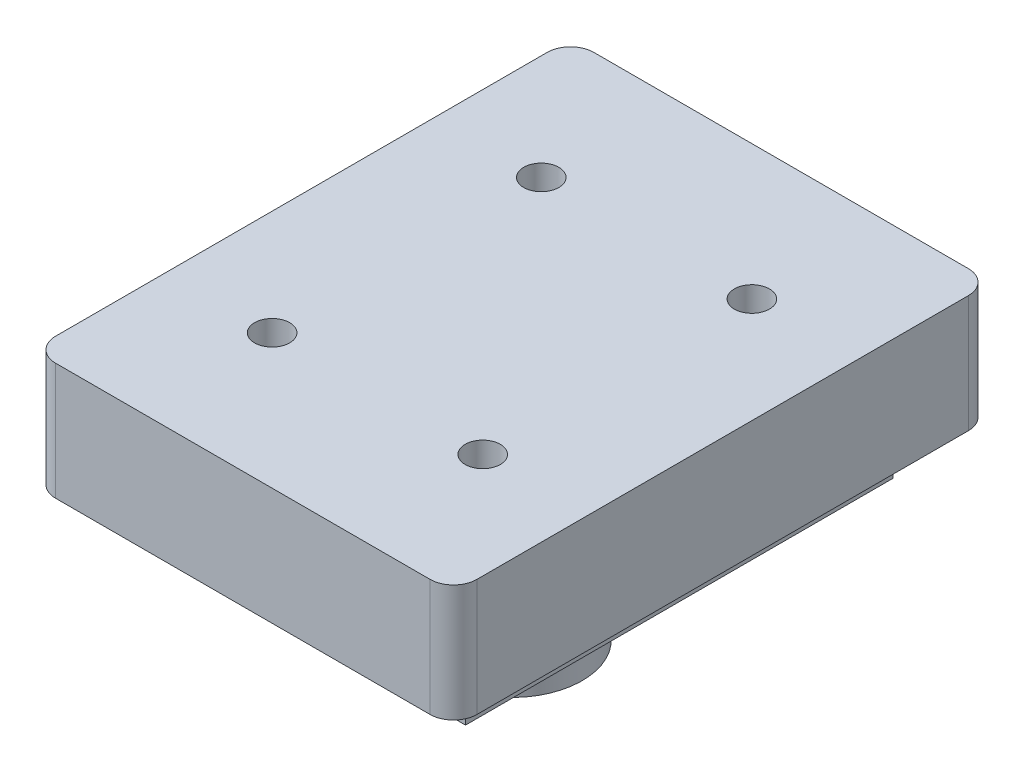
ISO-10303-21;
HEADER;
FILE_DESCRIPTION(('STEP AP214'),'2;1');
FILE_NAME('part.step','',(''),(''),'','','');
FILE_SCHEMA(('AUTOMOTIVE_DESIGN { 1 0 10303 214 1 1 1 1 }'));
ENDSEC;
DATA;
#1=APPLICATION_CONTEXT('core data for automotive mechanical design processes');
#2=APPLICATION_PROTOCOL_DEFINITION('international standard','automotive_design',2000,#1);
#3=PRODUCT_CONTEXT('',#1,'mechanical');
#4=PRODUCT('Part','Part','',(#3));
#5=PRODUCT_RELATED_PRODUCT_CATEGORY('part','',(#4));
#6=PRODUCT_DEFINITION_FORMATION('','',#4);
#7=PRODUCT_DEFINITION_CONTEXT('part definition',#1,'design');
#8=PRODUCT_DEFINITION('design','',#6,#7);
#9=PRODUCT_DEFINITION_SHAPE('','',#8);
#10=(LENGTH_UNIT() NAMED_UNIT(*) SI_UNIT(.MILLI.,.METRE.));
#11=(NAMED_UNIT(*) PLANE_ANGLE_UNIT() SI_UNIT($,.RADIAN.));
#12=(NAMED_UNIT(*) SI_UNIT($,.STERADIAN.) SOLID_ANGLE_UNIT());
#13=UNCERTAINTY_MEASURE_WITH_UNIT(LENGTH_MEASURE(1.E-05),#10,'distance_accuracy_value','');
#14=(GEOMETRIC_REPRESENTATION_CONTEXT(3) GLOBAL_UNCERTAINTY_ASSIGNED_CONTEXT((#13)) GLOBAL_UNIT_ASSIGNED_CONTEXT((#10,
#11,#12)) REPRESENTATION_CONTEXT('',''));
#15=CARTESIAN_POINT('',(0.,0.,0.));
#16=DIRECTION('',(0.,0.,1.));
#17=DIRECTION('',(1.,0.,0.));
#18=AXIS2_PLACEMENT_3D('',#15,#16,#17);
#19=CARTESIAN_POINT('',(0.,0.,0.));
#20=DIRECTION('',(0.,1.00000000000001,0.));
#21=DIRECTION('',(0.,0.,1.00000000000001));
#22=AXIS2_PLACEMENT_3D('',#19,#20,#21);
#23=PLANE('',#22);
#24=DIRECTION('',(-0.999999999999996,0.,0.));
#25=VECTOR('',#24,1.);
#26=CARTESIAN_POINT('',(-19.985789473684,0.,-28.650956937799));
#27=LINE('',#26,#25);
#28=CARTESIAN_POINT('',(23.1942105263158,0.,-28.650956937799));
#29=VERTEX_POINT('',#28);
#30=CARTESIAN_POINT('',(-17.445789473684,0.,-28.6509569377991));
#31=VERTEX_POINT('',#30);
#32=EDGE_CURVE('E208',#29,#31,#27,.T.);
#33=ORIENTED_EDGE('',*,*,#32,.F.);
#34=CARTESIAN_POINT('',(23.1942105263158,0.,-26.110956937799));
#35=DIRECTION('',(0.,1.00000000000001,0.));
#36=DIRECTION('',(0.,0.,1.00000000000001));
#37=AXIS2_PLACEMENT_3D('',#34,#35,#36);
#38=CIRCLE('',#37,2.54);
#39=CARTESIAN_POINT('',(25.7342105263158,0.,-26.110956937799));
#40=VERTEX_POINT('',#39);
#41=EDGE_CURVE('E252',#29,#40,#38,.F.);
#42=ORIENTED_EDGE('',*,*,#41,.T.);
#43=DIRECTION('',(0.,0.,-1.00000000000001));
#44=VECTOR('',#43,1.);
#45=CARTESIAN_POINT('',(25.7342105263158,0.,-28.650956937799));
#46=LINE('',#45,#44);
#47=CARTESIAN_POINT('',(25.7342105263158,0.,27.2290430622013));
#48=VERTEX_POINT('',#47);
#49=EDGE_CURVE('E226',#48,#40,#46,.T.);
#50=ORIENTED_EDGE('',*,*,#49,.F.);
#51=CARTESIAN_POINT('',(23.1942105263158,-1.11022302462516E-13,27.2290430622014));
#52=DIRECTION('',(0.,1.00000000000001,0.));
#53=DIRECTION('',(0.,0.,1.00000000000001));
#54=AXIS2_PLACEMENT_3D('',#51,#52,#53);
#55=CIRCLE('',#54,2.54);
#56=CARTESIAN_POINT('',(23.1942105263158,-1.11022302462516E-13,29.7690430622013));
#57=VERTEX_POINT('',#56);
#58=EDGE_CURVE('E243',#48,#57,#55,.F.);
#59=ORIENTED_EDGE('',*,*,#58,.T.);
#60=DIRECTION('',(0.999999999999996,0.,0.));
#61=VECTOR('',#60,1.);
#62=CARTESIAN_POINT('',(-19.9857894736841,1.38777878078145E-13,29.7690430622012));
#63=LINE('',#62,#61);
#64=CARTESIAN_POINT('',(-17.4457894736841,0.,29.7690430622012));
#65=VERTEX_POINT('',#64);
#66=EDGE_CURVE('E223',#65,#57,#63,.T.);
#67=ORIENTED_EDGE('',*,*,#66,.F.);
#68=CARTESIAN_POINT('',(-17.4457894736841,1.11022302462516E-13,27.2290430622013));
#69=DIRECTION('',(0.,1.00000000000001,0.));
#70=DIRECTION('',(0.,0.,1.00000000000001));
#71=AXIS2_PLACEMENT_3D('',#68,#69,#70);
#72=CIRCLE('',#71,2.54);
#73=CARTESIAN_POINT('',(-19.9857894736841,0.,27.2290430622011));
#74=VERTEX_POINT('',#73);
#75=EDGE_CURVE('E246',#65,#74,#72,.F.);
#76=ORIENTED_EDGE('',*,*,#75,.T.);
#77=DIRECTION('',(0.,0.,1.00000000000001));
#78=VECTOR('',#77,1.);
#79=CARTESIAN_POINT('',(-19.985789473684,0.,-28.650956937799));
#80=LINE('',#79,#78);
#81=CARTESIAN_POINT('',(-19.985789473684,0.,-26.110956937799));
#82=VERTEX_POINT('',#81);
#83=EDGE_CURVE('E200',#82,#74,#80,.T.);
#84=ORIENTED_EDGE('',*,*,#83,.F.);
#85=CARTESIAN_POINT('',(-17.445789473684,0.,-26.110956937799));
#86=DIRECTION('',(0.,1.00000000000001,0.));
#87=DIRECTION('',(0.,0.,1.00000000000001));
#88=AXIS2_PLACEMENT_3D('',#85,#86,#87);
#89=CIRCLE('',#88,2.54);
#90=EDGE_CURVE('E249',#82,#31,#89,.F.);
#91=ORIENTED_EDGE('',*,*,#90,.T.);
#92=EDGE_LOOP('',(#33,#42,#50,#59,#67,#76,#84,#91));
#93=FACE_BOUND('',#92,.T.);
#94=DIRECTION('',(0.,0.,-1.));
#95=VECTOR('',#94,1.);
#96=CARTESIAN_POINT('',(-15.2895205198493,0.,23.7682549545235));
#97=LINE('',#96,#95);
#98=CARTESIAN_POINT('',(-15.2895205198493,0.,23.7682549545235));
#99=VERTEX_POINT('',#98);
#100=CARTESIAN_POINT('',(-15.2895205198492,0.,-22.6501688301212));
#101=VERTEX_POINT('',#100);
#102=EDGE_CURVE('E162',#99,#101,#97,.T.);
#103=ORIENTED_EDGE('',*,*,#102,.F.);
#104=DIRECTION('',(-0.999999999999996,0.,0.));
#105=VECTOR('',#104,1.);
#106=CARTESIAN_POINT('',(-15.2895205198493,0.,23.7682549545235));
#107=LINE('',#106,#105);
#108=CARTESIAN_POINT('',(21.037941572481,0.,23.7682549545235));
#109=VERTEX_POINT('',#108);
#110=EDGE_CURVE('E159',#109,#99,#107,.T.);
#111=ORIENTED_EDGE('',*,*,#110,.F.);
#112=DIRECTION('',(0.,0.,1.));
#113=VECTOR('',#112,1.);
#114=CARTESIAN_POINT('',(21.037941572481,0.,23.7682549545235));
#115=LINE('',#114,#113);
#116=CARTESIAN_POINT('',(21.037941572481,0.,-22.6501688301212));
#117=VERTEX_POINT('',#116);
#118=EDGE_CURVE('E615',#117,#109,#115,.T.);
#119=ORIENTED_EDGE('',*,*,#118,.F.);
#120=DIRECTION('',(0.999999999999996,0.,0.));
#121=VECTOR('',#120,1.);
#122=CARTESIAN_POINT('',(-15.2895205198492,0.,-22.6501688301212));
#123=LINE('',#122,#121);
#124=EDGE_CURVE('E612',#101,#117,#123,.T.);
#125=ORIENTED_EDGE('',*,*,#124,.F.);
#126=EDGE_LOOP('',(#103,#111,#119,#125));
#127=FACE_BOUND('',#126,.T.);
#128=ADVANCED_FACE('F45',(#93,#127),#23,.F.);
#129=CARTESIAN_POINT('',(-19.985789473684,12.7000000000003,-28.650956937799));
#130=DIRECTION('',(0.999999999999996,0.,0.));
#131=DIRECTION('',(0.,0.,-1.00000000000001));
#132=AXIS2_PLACEMENT_3D('',#129,#130,#131);
#133=PLANE('',#132);
#134=DIRECTION('',(0.,0.,1.00000000000001));
#135=VECTOR('',#134,1.);
#136=CARTESIAN_POINT('',(-19.985789473684,12.7000000000003,-28.650956937799));
#137=LINE('',#136,#135);
#138=CARTESIAN_POINT('',(-19.985789473684,12.7000000000003,-26.110956937799));
#139=VERTEX_POINT('',#138);
#140=CARTESIAN_POINT('',(-19.9857894736841,12.7000000000003,27.2290430622012));
#141=VERTEX_POINT('',#140);
#142=EDGE_CURVE('E204',#139,#141,#137,.T.);
#143=ORIENTED_EDGE('',*,*,#142,.F.);
#144=DIRECTION('',(0.,-1.00000000000001,0.));
#145=VECTOR('',#144,1.);
#146=CARTESIAN_POINT('',(-19.985789473684,12.7000000000003,-26.110956937799));
#147=LINE('',#146,#145);
#148=EDGE_CURVE('E276',#139,#82,#147,.T.);
#149=ORIENTED_EDGE('',*,*,#148,.T.);
#150=ORIENTED_EDGE('',*,*,#83,.T.);
#151=DIRECTION('',(0.,-1.00000000000001,0.));
#152=VECTOR('',#151,1.);
#153=CARTESIAN_POINT('',(-19.9857894736841,12.7000000000003,27.2290430622012));
#154=LINE('',#153,#152);
#155=EDGE_CURVE('E273',#74,#141,#154,.F.);
#156=ORIENTED_EDGE('',*,*,#155,.T.);
#157=EDGE_LOOP('',(#143,#149,#150,#156));
#158=FACE_BOUND('',#157,.T.);
#159=ADVANCED_FACE('F317',(#158),#133,.F.);
#160=CARTESIAN_POINT('',(-19.9857894736841,12.7000000000002,29.7690430622013));
#161=DIRECTION('',(0.,0.,-1.00000000000001));
#162=DIRECTION('',(-0.999999999999996,0.,0.));
#163=AXIS2_PLACEMENT_3D('',#160,#161,#162);
#164=PLANE('',#163);
#165=DIRECTION('',(0.999999999999996,0.,0.));
#166=VECTOR('',#165,1.);
#167=CARTESIAN_POINT('',(-19.9857894736841,12.7000000000002,29.7690430622013));
#168=LINE('',#167,#166);
#169=CARTESIAN_POINT('',(-17.4457894736841,12.7000000000001,29.7690430622013));
#170=VERTEX_POINT('',#169);
#171=CARTESIAN_POINT('',(23.1942105263157,12.7000000000001,29.7690430622014));
#172=VERTEX_POINT('',#171);
#173=EDGE_CURVE('E207',#170,#172,#168,.T.);
#174=ORIENTED_EDGE('',*,*,#173,.F.);
#175=DIRECTION('',(0.,-1.00000000000001,0.));
#176=VECTOR('',#175,1.);
#177=CARTESIAN_POINT('',(-17.4457894736841,12.7000000000001,29.7690430622013));
#178=LINE('',#177,#176);
#179=EDGE_CURVE('E11',#170,#65,#178,.T.);
#180=ORIENTED_EDGE('',*,*,#179,.T.);
#181=ORIENTED_EDGE('',*,*,#66,.T.);
#182=DIRECTION('',(0.,-1.00000000000001,0.));
#183=VECTOR('',#182,1.);
#184=CARTESIAN_POINT('',(23.1942105263157,12.7000000000001,29.7690430622014));
#185=LINE('',#184,#183);
#186=EDGE_CURVE('E54',#57,#172,#185,.F.);
#187=ORIENTED_EDGE('',*,*,#186,.T.);
#188=EDGE_LOOP('',(#174,#180,#181,#187));
#189=FACE_BOUND('',#188,.T.);
#190=ADVANCED_FACE('F328',(#189),#164,.F.);
#191=CARTESIAN_POINT('',(25.7342105263158,12.7,-28.650956937799));
#192=DIRECTION('',(-0.999999999999996,0.,0.));
#193=DIRECTION('',(0.,0.,1.00000000000001));
#194=AXIS2_PLACEMENT_3D('',#191,#192,#193);
#195=PLANE('',#194);
#196=ORIENTED_EDGE('',*,*,#49,.T.);
#197=DIRECTION('',(0.,-1.00000000000001,0.));
#198=VECTOR('',#197,1.);
#199=CARTESIAN_POINT('',(25.7342105263158,12.7,-26.110956937799));
#200=LINE('',#199,#198);
#201=CARTESIAN_POINT('',(25.7342105263158,12.7,-26.110956937799));
#202=VERTEX_POINT('',#201);
#203=EDGE_CURVE('E259',#40,#202,#200,.F.);
#204=ORIENTED_EDGE('',*,*,#203,.T.);
#205=DIRECTION('',(0.,0.,-1.00000000000001));
#206=VECTOR('',#205,1.);
#207=CARTESIAN_POINT('',(25.7342105263158,12.7,-28.650956937799));
#208=LINE('',#207,#206);
#209=CARTESIAN_POINT('',(25.7342105263158,12.7,27.2290430622013));
#210=VERTEX_POINT('',#209);
#211=EDGE_CURVE('E211',#210,#202,#208,.T.);
#212=ORIENTED_EDGE('',*,*,#211,.F.);
#213=DIRECTION('',(0.,-1.00000000000001,0.));
#214=VECTOR('',#213,1.);
#215=CARTESIAN_POINT('',(25.7342105263158,12.7,27.2290430622013));
#216=LINE('',#215,#214);
#217=EDGE_CURVE('E255',#210,#48,#216,.T.);
#218=ORIENTED_EDGE('',*,*,#217,.T.);
#219=EDGE_LOOP('',(#196,#204,#212,#218));
#220=FACE_BOUND('',#219,.T.);
#221=ADVANCED_FACE('F336',(#220),#195,.F.);
#222=CARTESIAN_POINT('',(-19.985789473684,12.7000000000003,-28.650956937799));
#223=DIRECTION('',(0.,0.,1.00000000000001));
#224=DIRECTION('',(0.999999999999996,0.,0.));
#225=AXIS2_PLACEMENT_3D('',#222,#223,#224);
#226=PLANE('',#225);
#227=DIRECTION('',(-0.999999999999996,0.,0.));
#228=VECTOR('',#227,1.);
#229=CARTESIAN_POINT('',(-19.985789473684,12.7000000000003,-28.650956937799));
#230=LINE('',#229,#228);
#231=CARTESIAN_POINT('',(23.1942105263158,12.7,-28.650956937799));
#232=VERTEX_POINT('',#231);
#233=CARTESIAN_POINT('',(-17.445789473684,12.7000000000003,-28.6509569377989));
#234=VERTEX_POINT('',#233);
#235=EDGE_CURVE('E215',#232,#234,#230,.T.);
#236=ORIENTED_EDGE('',*,*,#235,.F.);
#237=DIRECTION('',(0.,-1.00000000000001,0.));
#238=VECTOR('',#237,1.);
#239=CARTESIAN_POINT('',(23.1942105263158,12.7,-28.650956937799));
#240=LINE('',#239,#238);
#241=EDGE_CURVE('E239',#232,#29,#240,.T.);
#242=ORIENTED_EDGE('',*,*,#241,.T.);
#243=ORIENTED_EDGE('',*,*,#32,.T.);
#244=DIRECTION('',(0.,-1.00000000000001,0.));
#245=VECTOR('',#244,1.);
#246=CARTESIAN_POINT('',(-17.445789473684,12.7000000000003,-28.6509569377989));
#247=LINE('',#246,#245);
#248=EDGE_CURVE('E236',#31,#234,#247,.F.);
#249=ORIENTED_EDGE('',*,*,#248,.T.);
#250=EDGE_LOOP('',(#236,#242,#243,#249));
#251=FACE_BOUND('',#250,.T.);
#252=ADVANCED_FACE('F344',(#251),#226,.F.);
#253=CARTESIAN_POINT('',(0.,12.7000000000002,2.0122792321331E-13));
#254=DIRECTION('',(0.,1.00000000000001,0.));
#255=DIRECTION('',(0.,0.,1.00000000000001));
#256=AXIS2_PLACEMENT_3D('',#253,#254,#255);
#257=PLANE('',#256);
#258=CARTESIAN_POINT('',(14.3042105263158,12.7,-14.045956937799));
#259=DIRECTION('',(0.,1.00000000000001,0.));
#260=DIRECTION('',(0.,0.,1.00000000000001));
#261=AXIS2_PLACEMENT_3D('',#258,#259,#260);
#262=CIRCLE('',#261,1.905);
#263=CARTESIAN_POINT('',(14.3042105263158,12.7,-12.140956937799));
#264=VERTEX_POINT('',#263);
#265=EDGE_CURVE('E185',#264,#264,#262,.T.);
#266=ORIENTED_EDGE('',*,*,#265,.F.);
#267=EDGE_LOOP('',(#266));
#268=FACE_BOUND('',#267,.T.);
#269=CARTESIAN_POINT('',(-8.55578947368408,12.7000000000002,15.1640430622012));
#270=DIRECTION('',(0.,1.00000000000001,0.));
#271=DIRECTION('',(0.,0.,1.00000000000001));
#272=AXIS2_PLACEMENT_3D('',#269,#270,#271);
#273=CIRCLE('',#272,1.905);
#274=CARTESIAN_POINT('',(-8.55578947368408,12.7000000000002,17.0690430622012));
#275=VERTEX_POINT('',#274);
#276=EDGE_CURVE('E178',#275,#275,#273,.T.);
#277=ORIENTED_EDGE('',*,*,#276,.F.);
#278=EDGE_LOOP('',(#277));
#279=FACE_BOUND('',#278,.T.);
#280=CARTESIAN_POINT('',(14.3042105263158,12.7000000000001,15.1640430622013));
#281=DIRECTION('',(0.,1.00000000000001,0.));
#282=DIRECTION('',(0.,0.,1.00000000000001));
#283=AXIS2_PLACEMENT_3D('',#280,#281,#282);
#284=CIRCLE('',#283,1.905);
#285=CARTESIAN_POINT('',(14.3042105263158,12.7000000000001,17.0690430622013));
#286=VERTEX_POINT('',#285);
#287=EDGE_CURVE('E164',#286,#286,#284,.T.);
#288=ORIENTED_EDGE('',*,*,#287,.F.);
#289=EDGE_LOOP('',(#288));
#290=FACE_BOUND('',#289,.T.);
#291=CARTESIAN_POINT('',(-8.55578947368407,12.7000000000003,-14.0459569377989));
#292=DIRECTION('',(0.,1.00000000000001,0.));
#293=DIRECTION('',(0.,0.,1.00000000000001));
#294=AXIS2_PLACEMENT_3D('',#291,#292,#293);
#295=CIRCLE('',#294,1.905);
#296=CARTESIAN_POINT('',(-8.55578947368407,12.7000000000003,-12.1409569377989));
#297=VERTEX_POINT('',#296);
#298=EDGE_CURVE('E184',#297,#297,#295,.T.);
#299=ORIENTED_EDGE('',*,*,#298,.F.);
#300=EDGE_LOOP('',(#299));
#301=FACE_BOUND('',#300,.T.);
#302=ORIENTED_EDGE('',*,*,#211,.T.);
#303=CARTESIAN_POINT('',(23.1942105263158,12.7,-26.110956937799));
#304=DIRECTION('',(0.,1.00000000000001,0.));
#305=DIRECTION('',(0.,0.,1.00000000000001));
#306=AXIS2_PLACEMENT_3D('',#303,#304,#305);
#307=CIRCLE('',#306,2.54);
#308=EDGE_CURVE('E270',#202,#232,#307,.T.);
#309=ORIENTED_EDGE('',*,*,#308,.T.);
#310=ORIENTED_EDGE('',*,*,#235,.T.);
#311=CARTESIAN_POINT('',(-17.445789473684,12.7000000000003,-26.110956937799));
#312=DIRECTION('',(0.,1.00000000000001,0.));
#313=DIRECTION('',(0.,0.,1.00000000000001));
#314=AXIS2_PLACEMENT_3D('',#311,#312,#313);
#315=CIRCLE('',#314,2.54);
#316=EDGE_CURVE('E267',#234,#139,#315,.T.);
#317=ORIENTED_EDGE('',*,*,#316,.T.);
#318=ORIENTED_EDGE('',*,*,#142,.T.);
#319=CARTESIAN_POINT('',(-17.4457894736842,12.7000000000002,27.2290430622013));
#320=DIRECTION('',(0.,1.00000000000001,0.));
#321=DIRECTION('',(0.,0.,1.00000000000001));
#322=AXIS2_PLACEMENT_3D('',#319,#320,#321);
#323=CIRCLE('',#322,2.54);
#324=EDGE_CURVE('E67',#141,#170,#323,.T.);
#325=ORIENTED_EDGE('',*,*,#324,.T.);
#326=ORIENTED_EDGE('',*,*,#173,.T.);
#327=CARTESIAN_POINT('',(23.1942105263158,12.7000000000001,27.2290430622013));
#328=DIRECTION('',(0.,1.00000000000001,0.));
#329=DIRECTION('',(0.,0.,1.00000000000001));
#330=AXIS2_PLACEMENT_3D('',#327,#328,#329);
#331=CIRCLE('',#330,2.54);
#332=EDGE_CURVE('E262',#172,#210,#331,.T.);
#333=ORIENTED_EDGE('',*,*,#332,.T.);
#334=EDGE_LOOP('',(#302,#309,#310,#317,#318,#325,#326,#333));
#335=FACE_BOUND('',#334,.T.);
#336=ADVANCED_FACE('F330',(#268,#279,#290,#301,#335),#257,.T.);
#337=CARTESIAN_POINT('',(-8.55578947368409,0.,-14.045956937799));
#338=DIRECTION('',(0.,1.00000000000001,0.));
#339=DIRECTION('',(0.,0.,1.00000000000001));
#340=AXIS2_PLACEMENT_3D('',#337,#338,#339);
#341=CYLINDRICAL_SURFACE('',#340,1.905);
#342=CARTESIAN_POINT('',(-8.55578947368409,0.,-14.045956937799));
#343=DIRECTION('',(0.,1.00000000000001,0.));
#344=DIRECTION('',(0.,0.,1.00000000000001));
#345=AXIS2_PLACEMENT_3D('',#342,#343,#344);
#346=CIRCLE('',#345,1.905);
#347=CARTESIAN_POINT('',(-8.55578947368409,0.,-12.140956937799));
#348=VERTEX_POINT('',#347);
#349=EDGE_CURVE('E196',#348,#348,#346,.T.);
#350=ORIENTED_EDGE('',*,*,#349,.F.);
#351=EDGE_LOOP('',(#350));
#352=FACE_BOUND('',#351,.T.);
#353=ORIENTED_EDGE('',*,*,#298,.T.);
#354=EDGE_LOOP('',(#353));
#355=FACE_BOUND('',#354,.T.);
#356=ADVANCED_FACE('F387',(#352,#355),#341,.F.);
#357=CARTESIAN_POINT('',(14.3042105263158,0.,15.164043062201));
#358=DIRECTION('',(0.,1.00000000000001,0.));
#359=DIRECTION('',(0.,0.,1.00000000000001));
#360=AXIS2_PLACEMENT_3D('',#357,#358,#359);
#361=CYLINDRICAL_SURFACE('',#360,1.905);
#362=CARTESIAN_POINT('',(14.3042105263158,0.,15.164043062201));
#363=DIRECTION('',(0.,1.00000000000001,0.));
#364=DIRECTION('',(0.,0.,1.00000000000001));
#365=AXIS2_PLACEMENT_3D('',#362,#363,#364);
#366=CIRCLE('',#365,1.905);
#367=CARTESIAN_POINT('',(14.3042105263158,0.,17.069043062201));
#368=VERTEX_POINT('',#367);
#369=EDGE_CURVE('E170',#368,#368,#366,.T.);
#370=ORIENTED_EDGE('',*,*,#369,.F.);
#371=EDGE_LOOP('',(#370));
#372=FACE_BOUND('',#371,.T.);
#373=ORIENTED_EDGE('',*,*,#287,.T.);
#374=EDGE_LOOP('',(#373));
#375=FACE_BOUND('',#374,.T.);
#376=ADVANCED_FACE('F394',(#372,#375),#361,.F.);
#377=CARTESIAN_POINT('',(-8.55578947368411,0.,15.1640430622012));
#378=DIRECTION('',(0.,1.00000000000001,0.));
#379=DIRECTION('',(0.,0.,1.00000000000001));
#380=AXIS2_PLACEMENT_3D('',#377,#378,#379);
#381=CYLINDRICAL_SURFACE('',#380,1.905);
#382=CARTESIAN_POINT('',(-8.55578947368411,0.,15.1640430622012));
#383=DIRECTION('',(0.,1.00000000000001,0.));
#384=DIRECTION('',(0.,0.,1.00000000000001));
#385=AXIS2_PLACEMENT_3D('',#382,#383,#384);
#386=CIRCLE('',#385,1.905);
#387=CARTESIAN_POINT('',(-8.55578947368411,0.,17.0690430622012));
#388=VERTEX_POINT('',#387);
#389=EDGE_CURVE('E189',#388,#388,#386,.T.);
#390=ORIENTED_EDGE('',*,*,#389,.F.);
#391=EDGE_LOOP('',(#390));
#392=FACE_BOUND('',#391,.T.);
#393=ORIENTED_EDGE('',*,*,#276,.T.);
#394=EDGE_LOOP('',(#393));
#395=FACE_BOUND('',#394,.T.);
#396=ADVANCED_FACE('F401',(#392,#395),#381,.F.);
#397=CARTESIAN_POINT('',(14.3042105263158,0.,-14.045956937799));
#398=DIRECTION('',(0.,1.00000000000001,0.));
#399=DIRECTION('',(0.,0.,1.00000000000001));
#400=AXIS2_PLACEMENT_3D('',#397,#398,#399);
#401=CYLINDRICAL_SURFACE('',#400,1.905);
#402=CARTESIAN_POINT('',(14.3042105263158,0.,-14.045956937799));
#403=DIRECTION('',(0.,1.00000000000001,0.));
#404=DIRECTION('',(0.,0.,1.00000000000001));
#405=AXIS2_PLACEMENT_3D('',#402,#403,#404);
#406=CIRCLE('',#405,1.905);
#407=CARTESIAN_POINT('',(14.3042105263158,0.,-12.140956937799));
#408=VERTEX_POINT('',#407);
#409=EDGE_CURVE('E180',#408,#408,#406,.T.);
#410=ORIENTED_EDGE('',*,*,#409,.F.);
#411=EDGE_LOOP('',(#410));
#412=FACE_BOUND('',#411,.T.);
#413=ORIENTED_EDGE('',*,*,#265,.T.);
#414=EDGE_LOOP('',(#413));
#415=FACE_BOUND('',#414,.T.);
#416=ADVANCED_FACE('F409',(#412,#415),#401,.F.);
#417=CARTESIAN_POINT('',(0.,0.,0.));
#418=DIRECTION('',(0.,-1.00000000000001,0.));
#419=DIRECTION('',(0.,0.,-1.00000000000001));
#420=AXIS2_PLACEMENT_3D('',#417,#418,#419);
#421=PLANE('',#420);
#422=ORIENTED_EDGE('',*,*,#409,.T.);
#423=EDGE_LOOP('',(#422));
#424=FACE_BOUND('',#423,.T.);
#425=ADVANCED_FACE('F417',(#424),#421,.F.);
#426=ORIENTED_EDGE('',*,*,#389,.T.);
#427=EDGE_LOOP('',(#426));
#428=FACE_BOUND('',#427,.T.);
#429=ADVANCED_FACE('F425',(#428),#421,.F.);
#430=ORIENTED_EDGE('',*,*,#369,.T.);
#431=EDGE_LOOP('',(#430));
#432=FACE_BOUND('',#431,.T.);
#433=ADVANCED_FACE('F434',(#432),#421,.F.);
#434=ORIENTED_EDGE('',*,*,#349,.T.);
#435=EDGE_LOOP('',(#434));
#436=FACE_BOUND('',#435,.T.);
#437=ADVANCED_FACE('F428',(#436),#421,.F.);
#438=CARTESIAN_POINT('',(-15.2895205198493,-5.08,23.7682549545234));
#439=DIRECTION('',(0.999999999999996,0.,0.));
#440=DIRECTION('',(0.,0.,-1.));
#441=AXIS2_PLACEMENT_3D('',#438,#439,#440);
#442=PLANE('',#441);
#443=ORIENTED_EDGE('',*,*,#102,.T.);
#444=DIRECTION('',(0.,1.00000000000001,0.));
#445=VECTOR('',#444,1.);
#446=CARTESIAN_POINT('',(-15.2895205198493,-5.08,-22.6501688301212));
#447=LINE('',#446,#445);
#448=CARTESIAN_POINT('',(-15.2895205198493,-5.08,-22.6501688301212));
#449=VERTEX_POINT('',#448);
#450=EDGE_CURVE('E141',#449,#101,#447,.T.);
#451=ORIENTED_EDGE('',*,*,#450,.F.);
#452=DIRECTION('',(0.,0.,-1.));
#453=VECTOR('',#452,1.);
#454=CARTESIAN_POINT('',(-15.2895205198493,-5.08,23.7682549545234));
#455=LINE('',#454,#453);
#456=CARTESIAN_POINT('',(-15.2895205198493,-5.08,23.7682549545234));
#457=VERTEX_POINT('',#456);
#458=EDGE_CURVE('E149',#457,#449,#455,.T.);
#459=ORIENTED_EDGE('',*,*,#458,.F.);
#460=DIRECTION('',(0.,1.00000000000001,0.));
#461=VECTOR('',#460,1.);
#462=CARTESIAN_POINT('',(-15.2895205198493,-5.08,23.7682549545234));
#463=LINE('',#462,#461);
#464=EDGE_CURVE('E609',#457,#99,#463,.T.);
#465=ORIENTED_EDGE('',*,*,#464,.T.);
#466=EDGE_LOOP('',(#443,#451,#459,#465));
#467=FACE_BOUND('',#466,.T.);
#468=ADVANCED_FACE('F161',(#467),#442,.F.);
#469=CARTESIAN_POINT('',(-15.2895205198493,-5.08,-22.6501688301212));
#470=DIRECTION('',(0.,0.,1.00000000000001));
#471=DIRECTION('',(0.999999999999996,0.,0.));
#472=AXIS2_PLACEMENT_3D('',#469,#470,#471);
#473=PLANE('',#472);
#474=ORIENTED_EDGE('',*,*,#124,.T.);
#475=DIRECTION('',(0.,1.00000000000001,0.));
#476=VECTOR('',#475,1.);
#477=CARTESIAN_POINT('',(21.037941572481,-5.08,-22.6501688301212));
#478=LINE('',#477,#476);
#479=CARTESIAN_POINT('',(21.037941572481,-5.08,-22.6501688301212));
#480=VERTEX_POINT('',#479);
#481=EDGE_CURVE('E144',#480,#117,#478,.T.);
#482=ORIENTED_EDGE('',*,*,#481,.F.);
#483=DIRECTION('',(0.999999999999996,0.,0.));
#484=VECTOR('',#483,1.);
#485=CARTESIAN_POINT('',(-15.2895205198493,-5.08,-22.6501688301212));
#486=LINE('',#485,#484);
#487=EDGE_CURVE('E136',#449,#480,#486,.T.);
#488=ORIENTED_EDGE('',*,*,#487,.F.);
#489=ORIENTED_EDGE('',*,*,#450,.T.);
#490=EDGE_LOOP('',(#474,#482,#488,#489));
#491=FACE_BOUND('',#490,.T.);
#492=ADVANCED_FACE('F139',(#491),#473,.F.);
#493=CARTESIAN_POINT('',(21.037941572481,-5.08000000000004,23.7682549545232));
#494=DIRECTION('',(-0.999999999999997,0.,0.));
#495=DIRECTION('',(0.,0.,1.));
#496=AXIS2_PLACEMENT_3D('',#493,#494,#495);
#497=PLANE('',#496);
#498=ORIENTED_EDGE('',*,*,#118,.T.);
#499=DIRECTION('',(0.,1.00000000000001,0.));
#500=VECTOR('',#499,1.);
#501=CARTESIAN_POINT('',(21.037941572481,-5.08000000000004,23.7682549545232));
#502=LINE('',#501,#500);
#503=CARTESIAN_POINT('',(21.037941572481,-5.08000000000004,23.7682549545232));
#504=VERTEX_POINT('',#503);
#505=EDGE_CURVE('E172',#504,#109,#502,.T.);
#506=ORIENTED_EDGE('',*,*,#505,.F.);
#507=DIRECTION('',(0.,0.,1.));
#508=VECTOR('',#507,1.);
#509=CARTESIAN_POINT('',(21.037941572481,-5.08000000000004,23.7682549545232));
#510=LINE('',#509,#508);
#511=EDGE_CURVE('E148',#480,#504,#510,.T.);
#512=ORIENTED_EDGE('',*,*,#511,.F.);
#513=ORIENTED_EDGE('',*,*,#481,.T.);
#514=EDGE_LOOP('',(#498,#506,#512,#513));
#515=FACE_BOUND('',#514,.T.);
#516=ADVANCED_FACE('F459',(#515),#497,.F.);
#517=CARTESIAN_POINT('',(-15.2895205198493,-5.08,23.7682549545234));
#518=DIRECTION('',(0.,0.,-1.));
#519=DIRECTION('',(-0.999999999999996,0.,0.));
#520=AXIS2_PLACEMENT_3D('',#517,#518,#519);
#521=PLANE('',#520);
#522=ORIENTED_EDGE('',*,*,#110,.T.);
#523=ORIENTED_EDGE('',*,*,#464,.F.);
#524=DIRECTION('',(-0.999999999999996,0.,0.));
#525=VECTOR('',#524,1.);
#526=CARTESIAN_POINT('',(-15.2895205198493,-5.08,23.7682549545234));
#527=LINE('',#526,#525);
#528=EDGE_CURVE('E154',#504,#457,#527,.T.);
#529=ORIENTED_EDGE('',*,*,#528,.F.);
#530=ORIENTED_EDGE('',*,*,#505,.T.);
#531=EDGE_LOOP('',(#522,#523,#529,#530));
#532=FACE_BOUND('',#531,.T.);
#533=ADVANCED_FACE('F466',(#532),#521,.F.);
#534=CARTESIAN_POINT('',(0.,-5.08,1.2490009027033E-13));
#535=DIRECTION('',(0.,-1.00000000000001,0.));
#536=DIRECTION('',(0.,0.,-1.00000000000001));
#537=AXIS2_PLACEMENT_3D('',#534,#535,#536);
#538=PLANE('',#537);
#539=CARTESIAN_POINT('',(2.87421052631581,-5.08,0.559043062200962));
#540=DIRECTION('',(0.,-1.00000000000001,0.));
#541=DIRECTION('',(0.,0.,-1.00000000000001));
#542=AXIS2_PLACEMENT_3D('',#539,#540,#541);
#543=CIRCLE('',#542,7.62);
#544=CARTESIAN_POINT('',(2.87421052631581,-5.07999999999999,-7.06095693779908));
#545=VERTEX_POINT('',#544);
#546=EDGE_CURVE('E594',#545,#545,#543,.T.);
#547=ORIENTED_EDGE('',*,*,#546,.F.);
#548=EDGE_LOOP('',(#547));
#549=FACE_BOUND('',#548,.T.);
#550=ORIENTED_EDGE('',*,*,#458,.T.);
#551=ORIENTED_EDGE('',*,*,#487,.T.);
#552=ORIENTED_EDGE('',*,*,#511,.T.);
#553=ORIENTED_EDGE('',*,*,#528,.T.);
#554=EDGE_LOOP('',(#550,#551,#552,#553));
#555=FACE_BOUND('',#554,.T.);
#556=ADVANCED_FACE('F152',(#549,#555),#538,.T.);
#557=CARTESIAN_POINT('',(2.87421052631582,-17.78,0.559043062200962));
#558=DIRECTION('',(0.,-1.00000000000001,0.));
#559=DIRECTION('',(0.,0.,-1.00000000000001));
#560=AXIS2_PLACEMENT_3D('',#557,#558,#559);
#561=PLANE('',#560);
#562=CARTESIAN_POINT('',(2.87421052631582,-17.78,0.559043062200962));
#563=DIRECTION('',(0.,-1.00000000000001,0.));
#564=DIRECTION('',(0.,0.,-1.00000000000001));
#565=AXIS2_PLACEMENT_3D('',#562,#563,#564);
#566=CIRCLE('',#565,7.62);
#567=CARTESIAN_POINT('',(2.87421052631582,-17.78,-7.06095693779908));
#568=VERTEX_POINT('',#567);
#569=EDGE_CURVE('E599',#568,#568,#566,.T.);
#570=ORIENTED_EDGE('',*,*,#569,.T.);
#571=EDGE_LOOP('',(#570));
#572=FACE_BOUND('',#571,.T.);
#573=CARTESIAN_POINT('',(2.87421052631582,-17.78,0.559043062200962));
#574=DIRECTION('',(0.,-1.00000000000001,0.));
#575=DIRECTION('',(0.,0.,-1.00000000000001));
#576=AXIS2_PLACEMENT_3D('',#573,#574,#575);
#577=CIRCLE('',#576,5.08);
#578=CARTESIAN_POINT('',(2.87421052631582,-17.78,-4.52095693779907));
#579=VERTEX_POINT('',#578);
#580=EDGE_CURVE('E591',#579,#579,#577,.T.);
#581=ORIENTED_EDGE('',*,*,#580,.F.);
#582=EDGE_LOOP('',(#581));
#583=FACE_BOUND('',#582,.T.);
#584=ADVANCED_FACE('F481',(#572,#583),#561,.T.);
#585=CARTESIAN_POINT('',(2.87421052631582,-17.78,0.559043062200962));
#586=DIRECTION('',(0.,1.00000000000001,0.));
#587=DIRECTION('',(0.,0.,1.00000000000001));
#588=AXIS2_PLACEMENT_3D('',#585,#586,#587);
#589=CYLINDRICAL_SURFACE('',#588,7.62);
#590=ORIENTED_EDGE('',*,*,#569,.F.);
#591=EDGE_LOOP('',(#590));
#592=FACE_BOUND('',#591,.T.);
#593=ORIENTED_EDGE('',*,*,#546,.T.);
#594=EDGE_LOOP('',(#593));
#595=FACE_BOUND('',#594,.T.);
#596=ADVANCED_FACE('F489',(#592,#595),#589,.T.);
#597=CARTESIAN_POINT('',(2.87421052631582,-17.78,0.559043062200962));
#598=DIRECTION('',(0.,1.00000000000001,0.));
#599=DIRECTION('',(0.,0.,1.00000000000001));
#600=AXIS2_PLACEMENT_3D('',#597,#598,#599);
#601=CYLINDRICAL_SURFACE('',#600,5.08);
#602=ORIENTED_EDGE('',*,*,#580,.T.);
#603=EDGE_LOOP('',(#602));
#604=FACE_BOUND('',#603,.T.);
#605=CARTESIAN_POINT('',(2.87421052631581,-5.08,0.559043062200962));
#606=DIRECTION('',(0.,-1.00000000000001,0.));
#607=DIRECTION('',(0.,0.,-1.00000000000001));
#608=AXIS2_PLACEMENT_3D('',#605,#606,#607);
#609=CIRCLE('',#608,5.08);
#610=CARTESIAN_POINT('',(2.87421052631581,-5.08,-4.52095693779907));
#611=VERTEX_POINT('',#610);
#612=EDGE_CURVE('E219',#611,#611,#609,.F.);
#613=ORIENTED_EDGE('',*,*,#612,.T.);
#614=EDGE_LOOP('',(#613));
#615=FACE_BOUND('',#614,.T.);
#616=ADVANCED_FACE('F497',(#604,#615),#601,.F.);
#617=ORIENTED_EDGE('',*,*,#612,.F.);
#618=EDGE_LOOP('',(#617));
#619=FACE_BOUND('',#618,.T.);
#620=ADVANCED_FACE('F353',(#619),#538,.T.);
#621=CARTESIAN_POINT('',(23.1942105263158,12.7,-26.110956937799));
#622=DIRECTION('',(0.,-1.00000000000001,0.));
#623=DIRECTION('',(0.,0.,-1.00000000000001));
#624=AXIS2_PLACEMENT_3D('',#621,#622,#623);
#625=CYLINDRICAL_SURFACE('',#624,2.54);
#626=ORIENTED_EDGE('',*,*,#308,.F.);
#627=ORIENTED_EDGE('',*,*,#203,.F.);
#628=ORIENTED_EDGE('',*,*,#41,.F.);
#629=ORIENTED_EDGE('',*,*,#241,.F.);
#630=EDGE_LOOP('',(#626,#627,#628,#629));
#631=FACE_BOUND('',#630,.T.);
#632=ADVANCED_FACE('F341',(#631),#625,.T.);
#633=CARTESIAN_POINT('',(-17.445789473684,12.7000000000003,-26.110956937799));
#634=DIRECTION('',(0.,-1.00000000000001,0.));
#635=DIRECTION('',(0.,0.,-1.00000000000001));
#636=AXIS2_PLACEMENT_3D('',#633,#634,#635);
#637=CYLINDRICAL_SURFACE('',#636,2.54);
#638=ORIENTED_EDGE('',*,*,#316,.F.);
#639=ORIENTED_EDGE('',*,*,#248,.F.);
#640=ORIENTED_EDGE('',*,*,#90,.F.);
#641=ORIENTED_EDGE('',*,*,#148,.F.);
#642=EDGE_LOOP('',(#638,#639,#640,#641));
#643=FACE_BOUND('',#642,.T.);
#644=ADVANCED_FACE('F346',(#643),#637,.T.);
#645=CARTESIAN_POINT('',(-17.4457894736842,12.7000000000002,27.2290430622013));
#646=DIRECTION('',(0.,-1.00000000000001,0.));
#647=DIRECTION('',(0.,0.,-1.00000000000001));
#648=AXIS2_PLACEMENT_3D('',#645,#646,#647);
#649=CYLINDRICAL_SURFACE('',#648,2.54);
#650=ORIENTED_EDGE('',*,*,#324,.F.);
#651=ORIENTED_EDGE('',*,*,#155,.F.);
#652=ORIENTED_EDGE('',*,*,#75,.F.);
#653=ORIENTED_EDGE('',*,*,#179,.F.);
#654=EDGE_LOOP('',(#650,#651,#652,#653));
#655=FACE_BOUND('',#654,.T.);
#656=ADVANCED_FACE('F327',(#655),#649,.T.);
#657=CARTESIAN_POINT('',(23.1942105263158,12.7000000000001,27.2290430622013));
#658=DIRECTION('',(0.,-1.00000000000001,0.));
#659=DIRECTION('',(0.,0.,-1.00000000000001));
#660=AXIS2_PLACEMENT_3D('',#657,#658,#659);
#661=CYLINDRICAL_SURFACE('',#660,2.54);
#662=ORIENTED_EDGE('',*,*,#332,.F.);
#663=ORIENTED_EDGE('',*,*,#186,.F.);
#664=ORIENTED_EDGE('',*,*,#58,.F.);
#665=ORIENTED_EDGE('',*,*,#217,.F.);
#666=EDGE_LOOP('',(#662,#663,#664,#665));
#667=FACE_BOUND('',#666,.T.);
#668=ADVANCED_FACE('F47',(#667),#661,.T.);
#669=CLOSED_SHELL('',(#128,#159,#190,#221,#252,#336,#356,#376,#396,#416,#425,#429,#433,#437,
#468,#492,#516,#533,#556,#584,#596,#616,#620,#632,#644,#656,#668));
#670=MANIFOLD_SOLID_BREP('B2',#669);
#671=ADVANCED_BREP_SHAPE_REPRESENTATION('',(#18,#670),#14);
#672=SHAPE_DEFINITION_REPRESENTATION(#9,#671);
ENDSEC;
END-ISO-10303-21;
